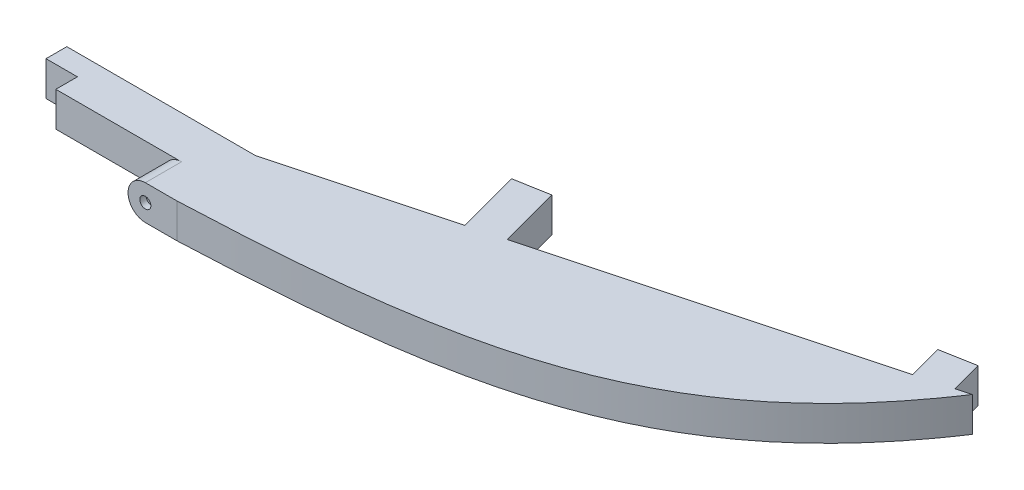
ISO-10303-21;
HEADER;
FILE_DESCRIPTION(('STEP AP214'),'2;1');
FILE_NAME('part.step','',(''),(''),'','','');
FILE_SCHEMA(('AUTOMOTIVE_DESIGN { 1 0 10303 214 1 1 1 1 }'));
ENDSEC;
DATA;
#1=APPLICATION_CONTEXT('core data for automotive mechanical design processes');
#2=APPLICATION_PROTOCOL_DEFINITION('international standard','automotive_design',2000,#1);
#3=PRODUCT_CONTEXT('',#1,'mechanical');
#4=PRODUCT('Part','Part','',(#3));
#5=PRODUCT_RELATED_PRODUCT_CATEGORY('part','',(#4));
#6=PRODUCT_DEFINITION_FORMATION('','',#4);
#7=PRODUCT_DEFINITION_CONTEXT('part definition',#1,'design');
#8=PRODUCT_DEFINITION('design','',#6,#7);
#9=PRODUCT_DEFINITION_SHAPE('','',#8);
#10=(LENGTH_UNIT() NAMED_UNIT(*) SI_UNIT(.MILLI.,.METRE.));
#11=(NAMED_UNIT(*) PLANE_ANGLE_UNIT() SI_UNIT($,.RADIAN.));
#12=(NAMED_UNIT(*) SI_UNIT($,.STERADIAN.) SOLID_ANGLE_UNIT());
#13=UNCERTAINTY_MEASURE_WITH_UNIT(LENGTH_MEASURE(1.E-05),#10,'distance_accuracy_value','');
#14=(GEOMETRIC_REPRESENTATION_CONTEXT(3) GLOBAL_UNCERTAINTY_ASSIGNED_CONTEXT((#13)) GLOBAL_UNIT_ASSIGNED_CONTEXT((#10,
#11,#12)) REPRESENTATION_CONTEXT('',''));
#15=CARTESIAN_POINT('',(0.,0.,0.));
#16=DIRECTION('',(0.,0.,1.));
#17=DIRECTION('',(1.,0.,0.));
#18=AXIS2_PLACEMENT_3D('',#15,#16,#17);
#19=CARTESIAN_POINT('',(-3.12500000003779,5.5,-11.6626587736309));
#20=DIRECTION('',(-0.258819045105893,0.,-0.965925826288165));
#21=DIRECTION('',(-0.965925826288165,0.,0.258819045105893));
#22=AXIS2_PLACEMENT_3D('',#19,#20,#21);
#23=PLANE('',#22);
#24=DIRECTION('',(0.965925826288165,0.,-0.258819045105893));
#25=VECTOR('',#24,1.);
#26=CARTESIAN_POINT('',(-3.12500000003779,5.5,-11.6626587736309));
#27=LINE('',#26,#25);
#28=CARTESIAN_POINT('',(31.6340708109374,5.5,-20.976323727218));
#29=VERTEX_POINT('',#28);
#30=CARTESIAN_POINT('',(82.5140748462668,5.5,-34.6095797195671));
#31=VERTEX_POINT('',#30);
#32=EDGE_CURVE('E298',#29,#31,#27,.T.);
#33=ORIENTED_EDGE('',*,*,#32,.T.);
#34=DIRECTION('',(0.,1.,0.));
#35=VECTOR('',#34,1.);
#36=CARTESIAN_POINT('',(82.5140748462667,0.,-34.6095797195671));
#37=LINE('',#36,#35);
#38=CARTESIAN_POINT('',(82.5140748462668,0.,-34.6095797195671));
#39=VERTEX_POINT('',#38);
#40=EDGE_CURVE('E61',#39,#31,#37,.T.);
#41=ORIENTED_EDGE('',*,*,#40,.F.);
#42=DIRECTION('',(0.965925826288165,0.,-0.258819045105893));
#43=VECTOR('',#42,1.);
#44=CARTESIAN_POINT('',(-3.12500000003779,0.,-11.6626587736309));
#45=LINE('',#44,#43);
#46=CARTESIAN_POINT('',(31.6340708109374,0.,-20.976323727218));
#47=VERTEX_POINT('',#46);
#48=EDGE_CURVE('E288',#47,#39,#45,.T.);
#49=ORIENTED_EDGE('',*,*,#48,.F.);
#50=DIRECTION('',(0.,1.,0.));
#51=VECTOR('',#50,1.);
#52=CARTESIAN_POINT('',(31.6340708109374,0.,-20.976323727218));
#53=LINE('',#52,#51);
#54=EDGE_CURVE('E203',#47,#29,#53,.T.);
#55=ORIENTED_EDGE('',*,*,#54,.T.);
#56=EDGE_LOOP('',(#33,#41,#49,#55));
#57=FACE_BOUND('',#56,.T.);
#58=ADVANCED_FACE('F35',(#57),#23,.T.);
#59=CARTESIAN_POINT('',(0.,5.5,-12.5));
#60=VERTEX_POINT('',#59);
#61=CARTESIAN_POINT('',(26.3214787663525,5.5,-19.5528189791356));
#62=VERTEX_POINT('',#61);
#63=EDGE_CURVE('E283',#60,#62,#27,.T.);
#64=ORIENTED_EDGE('',*,*,#63,.T.);
#65=DIRECTION('',(0.,1.,0.));
#66=VECTOR('',#65,1.);
#67=CARTESIAN_POINT('',(26.3214787663525,0.,-19.5528189791356));
#68=LINE('',#67,#66);
#69=CARTESIAN_POINT('',(26.3214787663525,0.,-19.5528189791356));
#70=VERTEX_POINT('',#69);
#71=EDGE_CURVE('E211',#70,#62,#68,.T.);
#72=ORIENTED_EDGE('',*,*,#71,.F.);
#73=CARTESIAN_POINT('',(0.,0.,-12.5));
#74=VERTEX_POINT('',#73);
#75=EDGE_CURVE('E284',#74,#70,#45,.T.);
#76=ORIENTED_EDGE('',*,*,#75,.F.);
#77=DIRECTION('',(0.,-1.,0.));
#78=VECTOR('',#77,1.);
#79=CARTESIAN_POINT('',(0.,5.5,-12.5));
#80=LINE('',#79,#78);
#81=EDGE_CURVE('E280',#60,#74,#80,.T.);
#82=ORIENTED_EDGE('',*,*,#81,.F.);
#83=EDGE_LOOP('',(#64,#72,#76,#82));
#84=FACE_BOUND('',#83,.T.);
#85=ADVANCED_FACE('F357',(#84),#23,.T.);
#86=CARTESIAN_POINT('',(0.,5.5,0.));
#87=DIRECTION('',(0.,1.,0.));
#88=DIRECTION('',(0.,0.,1.));
#89=AXIS2_PLACEMENT_3D('',#86,#87,#88);
#90=PLANE('',#89);
#91=DIRECTION('',(-1.,0.,0.));
#92=VECTOR('',#91,1.);
#93=CARTESIAN_POINT('',(0.,5.5,-5.75));
#94=LINE('',#93,#92);
#95=CARTESIAN_POINT('',(-5.,5.5,-5.75));
#96=VERTEX_POINT('',#95);
#97=CARTESIAN_POINT('',(-25.,5.5,-5.75));
#98=VERTEX_POINT('',#97);
#99=EDGE_CURVE('E257',#96,#98,#94,.T.);
#100=ORIENTED_EDGE('',*,*,#99,.F.);
#101=DIRECTION('',(0.,0.,1.));
#102=VECTOR('',#101,1.);
#103=CARTESIAN_POINT('',(-5.,5.5,-5.75));
#104=LINE('',#103,#102);
#105=CARTESIAN_POINT('',(-5.,5.5,0.));
#106=VERTEX_POINT('',#105);
#107=EDGE_CURVE('E265',#96,#106,#104,.T.);
#108=ORIENTED_EDGE('',*,*,#107,.T.);
#109=DIRECTION('',(1.,0.,0.));
#110=VECTOR('',#109,1.);
#111=CARTESIAN_POINT('',(-25.,5.5,0.));
#112=LINE('',#111,#110);
#113=CARTESIAN_POINT('',(0.,5.5,0.));
#114=VERTEX_POINT('',#113);
#115=EDGE_CURVE('E294',#106,#114,#112,.T.);
#116=ORIENTED_EDGE('',*,*,#115,.T.);
#117=CARTESIAN_POINT('',(-3.99701542976772E-10,5.5,1.60987063267593E-11));
#118=CARTESIAN_POINT('',(0.391394635243987,5.5,-0.0157750053797903));
#119=CARTESIAN_POINT('',(1.18697403500994,5.5,-0.0487759685721944));
#120=CARTESIAN_POINT('',(2.97371886532466,5.5,-0.125104104098016));
#121=CARTESIAN_POINT('',(4.54008890350178,5.5,-0.200260299116027));
#122=CARTESIAN_POINT('',(6.56661566228479,5.5,-0.300718996412045));
#123=CARTESIAN_POINT('',(8.32527633580625,5.5,-0.397659311451367));
#124=CARTESIAN_POINT('',(10.2393452977797,5.5,-0.508699866994759));
#125=CARTESIAN_POINT('',(12.0656989604106,5.5,-0.624646024555069));
#126=CARTESIAN_POINT('',(14.40145764918,5.5,-0.783062706143124));
#127=CARTESIAN_POINT('',(17.1745755641682,5.5,-0.991527453441799));
#128=CARTESIAN_POINT('',(20.424315772466,5.5,-1.26709563175987));
#129=CARTESIAN_POINT('',(24.1240411308153,5.5,-1.63189072491645));
#130=CARTESIAN_POINT('',(28.7464994471539,5.5,-2.16058829893543));
#131=CARTESIAN_POINT('',(34.1867170255386,5.5,-2.91640899189201));
#132=CARTESIAN_POINT('',(39.5992056703536,5.5,-3.86946359541546));
#133=CARTESIAN_POINT('',(44.9594427783575,5.5,-5.07707429287321));
#134=CARTESIAN_POINT('',(49.3618158266038,5.5,-6.28041823104868));
#135=CARTESIAN_POINT('',(52.9106920919481,5.5,-7.40087892256267));
#136=CARTESIAN_POINT('',(56.4081688521761,5.5,-8.67392879261675));
#137=CARTESIAN_POINT('',(59.8414498968872,5.5,-10.1114509716341));
#138=CARTESIAN_POINT('',(63.1969179772328,5.5,-11.7229728519031));
#139=CARTESIAN_POINT('',(66.4599871789213,5.5,-13.5144576410817));
#140=CARTESIAN_POINT('',(69.6166694042394,5.5,-15.487724176846));
#141=CARTESIAN_POINT('',(72.6542167339057,5.5,-17.6397938307028));
#142=CARTESIAN_POINT('',(75.5626334687585,5.5,-19.9635545523168));
#143=CARTESIAN_POINT('',(78.4114017746989,5.5,-22.5164023394282));
#144=CARTESIAN_POINT('',(80.637238298566,5.5,-24.7501277094886));
#145=CARTESIAN_POINT('',(82.3142030197585,5.5,-26.5768651787128));
#146=CARTESIAN_POINT('',(83.5001747606079,5.5,-27.9419093881025));
#147=CARTESIAN_POINT('',(84.1664515213518,5.5,-28.7295443987983));
#148=CARTESIAN_POINT('',(84.8247205965813,5.5,-29.5294985845606));
#149=CARTESIAN_POINT('',(85.4679017851143,5.5,-30.3305725761852));
#150=CARTESIAN_POINT('',(86.1096180697003,5.5,-31.152932898829));
#151=CARTESIAN_POINT('',(86.7258248018456,5.5,-31.9596372628073));
#152=CARTESIAN_POINT('',(87.3592157753844,5.5,-32.8149139023531));
#153=CARTESIAN_POINT('',(87.9353037158166,5.5,-33.6053343053545));
#154=CARTESIAN_POINT('',(88.5853514629931,5.5,-34.5293993999494));
#155=CARTESIAN_POINT('',(89.0772563702062,5.5,-35.2347214328894));
#156=CARTESIAN_POINT('',(89.639386065092,5.5,-36.0720039579726));
#157=CARTESIAN_POINT('',(89.8802416271091,5.5,-36.4338646602888));
#158=CARTESIAN_POINT('',(89.9999999999999,5.5,-36.6154273191376));
#159=B_SPLINE_CURVE_WITH_KNOTS('',4,(#117,#118,#119,#120,#121,#122,#123,#124,#125,#126,#127,
#128,#129,#130,#131,#132,#133,#134,#135,#136,#137,#138,#139,#140,#141,#142,#143,#144,#145,#146,
#147,#148,#149,#150,#151,#152,#153,#154,#155,#156,#157,#158),.UNSPECIFIED.,.F.,.F.,(5,1,1,1,1,1,
1,1,1,1,1,1,1,1,1,1,1,1,1,1,1,1,1,1,1,1,1,1,1,1,1,1,1,1,1,1,1,1,5),(0.0745428257623953,
0.0899420051313668,0.105341184500338,0.12074036386931,0.136139543238281,0.151538722821234,
0.166937902404187,0.18233708198714,0.197736261570092,0.22853461972874,0.259332977887387,
0.290131334919768,0.320929691952149,0.382526405312846,0.441205382352089,0.472003704326887,
0.502802054328003,0.533600415642708,0.564398766278646,0.595197066314678,0.62599542278122,
0.656793871998032,0.687592091282058,0.718390432587616,0.749188737095499,0.779987362687061,
0.814189108794913,0.82273965192033,0.831290195045747,0.839840738171165,0.848391281296582,
0.856941795912113,0.865492310527644,0.874042825143175,0.882593339758706,0.891143874173129,
0.899694408587551,0.908244943001974,0.916795477416396),.UNSPECIFIED.);
#160=CARTESIAN_POINT('',(90.,5.5,-36.6154273191378));
#161=VERTEX_POINT('',#160);
#162=EDGE_CURVE('E287',#114,#161,#159,.T.);
#163=ORIENTED_EDGE('',*,*,#162,.T.);
#164=CARTESIAN_POINT('',(87.8266668908516,5.5,-36.0330844676495));
#165=VERTEX_POINT('',#164);
#166=EDGE_CURVE('E299',#165,#161,#27,.T.);
#167=ORIENTED_EDGE('',*,*,#166,.F.);
#168=DIRECTION('',(-0.258819045105892,0.,-0.965925826288165));
#169=VECTOR('',#168,1.);
#170=CARTESIAN_POINT('',(90.9516668908894,5.5,-24.3704256940185));
#171=LINE('',#170,#169);
#172=CARTESIAN_POINT('',(86.4840847989428,5.5,-41.0436690479154));
#173=VERTEX_POINT('',#172);
#174=EDGE_CURVE('E188',#165,#173,#171,.T.);
#175=ORIENTED_EDGE('',*,*,#174,.T.);
#176=DIRECTION('',(-0.984070395292495,0.,0.177779237001607));
#177=VECTOR('',#176,1.);
#178=CARTESIAN_POINT('',(-4.44710939388558,5.5,-24.6163093787516));
#179=LINE('',#178,#177);
#180=CARTESIAN_POINT('',(81.0529693032083,5.5,-40.0624998414052));
#181=VERTEX_POINT('',#180);
#182=EDGE_CURVE('E164',#173,#181,#179,.T.);
#183=ORIENTED_EDGE('',*,*,#182,.T.);
#184=DIRECTION('',(-0.258819045105893,0.,-0.965925826288165));
#185=VECTOR('',#184,1.);
#186=CARTESIAN_POINT('',(85.6390748463045,5.5,-22.9469209459362));
#187=LINE('',#186,#185);
#188=EDGE_CURVE('E185',#31,#181,#187,.T.);
#189=ORIENTED_EDGE('',*,*,#188,.F.);
#190=ORIENTED_EDGE('',*,*,#32,.F.);
#191=DIRECTION('',(-0.258819045105893,0.,-0.965925826288165));
#192=VECTOR('',#191,1.);
#193=CARTESIAN_POINT('',(34.7590708109752,5.5,-9.31366495358707));
#194=LINE('',#193,#192);
#195=CARTESIAN_POINT('',(29.0378369496948,5.5,-30.6656004055709));
#196=VERTEX_POINT('',#195);
#197=EDGE_CURVE('E191',#29,#196,#194,.T.);
#198=ORIENTED_EDGE('',*,*,#197,.T.);
#199=DIRECTION('',(-0.984070395292495,0.,0.177779237001607));
#200=VECTOR('',#199,1.);
#201=CARTESIAN_POINT('',(-4.44710939388558,5.5,-24.6163093787516));
#202=LINE('',#201,#200);
#203=CARTESIAN_POINT('',(23.6067214539603,5.5,-29.6844311990608));
#204=VERTEX_POINT('',#203);
#205=EDGE_CURVE('E206',#196,#204,#202,.T.);
#206=ORIENTED_EDGE('',*,*,#205,.T.);
#207=DIRECTION('',(-0.258819045105893,0.,-0.965925826288165));
#208=VECTOR('',#207,1.);
#209=CARTESIAN_POINT('',(29.4464787663903,5.5,-7.89016020550466));
#210=LINE('',#209,#208);
#211=EDGE_CURVE('E198',#62,#204,#210,.T.);
#212=ORIENTED_EDGE('',*,*,#211,.F.);
#213=ORIENTED_EDGE('',*,*,#63,.F.);
#214=DIRECTION('',(1.,0.,0.));
#215=VECTOR('',#214,1.);
#216=CARTESIAN_POINT('',(-25.,5.5,-12.5));
#217=LINE('',#216,#215);
#218=CARTESIAN_POINT('',(-30.,5.5,-12.5));
#219=VERTEX_POINT('',#218);
#220=EDGE_CURVE('E309',#219,#60,#217,.T.);
#221=ORIENTED_EDGE('',*,*,#220,.F.);
#222=DIRECTION('',(0.,0.,-1.));
#223=VECTOR('',#222,1.);
#224=CARTESIAN_POINT('',(-30.,5.5,0.));
#225=LINE('',#224,#223);
#226=CARTESIAN_POINT('',(-30.,5.5,-9.18749999999999));
#227=VERTEX_POINT('',#226);
#228=EDGE_CURVE('E224',#227,#219,#225,.T.);
#229=ORIENTED_EDGE('',*,*,#228,.F.);
#230=DIRECTION('',(1.,0.,0.));
#231=VECTOR('',#230,1.);
#232=CARTESIAN_POINT('',(-30.,5.5,-9.18749999999999));
#233=LINE('',#232,#231);
#234=CARTESIAN_POINT('',(-25.,5.5,-9.18749999999999));
#235=VERTEX_POINT('',#234);
#236=EDGE_CURVE('E245',#227,#235,#233,.T.);
#237=ORIENTED_EDGE('',*,*,#236,.T.);
#238=DIRECTION('',(0.,0.,-1.));
#239=VECTOR('',#238,1.);
#240=CARTESIAN_POINT('',(-25.,5.5,-12.5));
#241=LINE('',#240,#239);
#242=EDGE_CURVE('E271',#98,#235,#241,.T.);
#243=ORIENTED_EDGE('',*,*,#242,.F.);
#244=EDGE_LOOP('',(#100,#108,#116,#163,#167,#175,#183,#189,#190,#198,#206,#212,#213,#221,#229,
#237,#243));
#245=FACE_BOUND('',#244,.T.);
#246=ADVANCED_FACE('F332',(#245),#90,.T.);
#247=CARTESIAN_POINT('',(0.,0.,0.));
#248=DIRECTION('',(0.,1.,0.));
#249=DIRECTION('',(0.,0.,1.));
#250=AXIS2_PLACEMENT_3D('',#247,#248,#249);
#251=PLANE('',#250);
#252=DIRECTION('',(0.,0.,1.));
#253=VECTOR('',#252,1.);
#254=CARTESIAN_POINT('',(-5.,0.,-5.75));
#255=LINE('',#254,#253);
#256=CARTESIAN_POINT('',(-5.,0.,-5.75));
#257=VERTEX_POINT('',#256);
#258=CARTESIAN_POINT('',(-5.,0.,0.));
#259=VERTEX_POINT('',#258);
#260=EDGE_CURVE('E262',#257,#259,#255,.T.);
#261=ORIENTED_EDGE('',*,*,#260,.F.);
#262=DIRECTION('',(1.,0.,0.));
#263=VECTOR('',#262,1.);
#264=CARTESIAN_POINT('',(0.,0.,-5.75));
#265=LINE('',#264,#263);
#266=CARTESIAN_POINT('',(-25.,0.,-5.75));
#267=VERTEX_POINT('',#266);
#268=EDGE_CURVE('E260',#267,#257,#265,.T.);
#269=ORIENTED_EDGE('',*,*,#268,.F.);
#270=DIRECTION('',(0.,0.,1.));
#271=VECTOR('',#270,1.);
#272=CARTESIAN_POINT('',(-25.,0.,-12.5));
#273=LINE('',#272,#271);
#274=CARTESIAN_POINT('',(-25.,0.,-9.18749999999999));
#275=VERTEX_POINT('',#274);
#276=EDGE_CURVE('E241',#275,#267,#273,.T.);
#277=ORIENTED_EDGE('',*,*,#276,.F.);
#278=DIRECTION('',(1.,0.,0.));
#279=VECTOR('',#278,1.);
#280=CARTESIAN_POINT('',(-30.,0.,-9.18749999999999));
#281=LINE('',#280,#279);
#282=CARTESIAN_POINT('',(-30.,0.,-9.18749999999999));
#283=VERTEX_POINT('',#282);
#284=EDGE_CURVE('E232',#283,#275,#281,.T.);
#285=ORIENTED_EDGE('',*,*,#284,.F.);
#286=DIRECTION('',(0.,0.,1.));
#287=VECTOR('',#286,1.);
#288=CARTESIAN_POINT('',(-30.,0.,0.));
#289=LINE('',#288,#287);
#290=CARTESIAN_POINT('',(-30.,0.,-12.5));
#291=VERTEX_POINT('',#290);
#292=EDGE_CURVE('E230',#291,#283,#289,.T.);
#293=ORIENTED_EDGE('',*,*,#292,.F.);
#294=DIRECTION('',(1.,0.,0.));
#295=VECTOR('',#294,1.);
#296=CARTESIAN_POINT('',(-25.,0.,-12.5));
#297=LINE('',#296,#295);
#298=EDGE_CURVE('E312',#291,#74,#297,.T.);
#299=ORIENTED_EDGE('',*,*,#298,.T.);
#300=ORIENTED_EDGE('',*,*,#75,.T.);
#301=DIRECTION('',(-0.258819045105893,0.,-0.965925826288165));
#302=VECTOR('',#301,1.);
#303=CARTESIAN_POINT('',(29.4464787663903,0.,-7.89016020550466));
#304=LINE('',#303,#302);
#305=CARTESIAN_POINT('',(23.6067214539603,0.,-29.6844311990608));
#306=VERTEX_POINT('',#305);
#307=EDGE_CURVE('E201',#70,#306,#304,.T.);
#308=ORIENTED_EDGE('',*,*,#307,.T.);
#309=DIRECTION('',(-0.984070395292495,0.,0.177779237001607));
#310=VECTOR('',#309,1.);
#311=CARTESIAN_POINT('',(-4.44710939388558,0.,-24.6163093787516));
#312=LINE('',#311,#310);
#313=CARTESIAN_POINT('',(29.0378369496948,0.,-30.6656004055709));
#314=VERTEX_POINT('',#313);
#315=EDGE_CURVE('E197',#314,#306,#312,.T.);
#316=ORIENTED_EDGE('',*,*,#315,.F.);
#317=DIRECTION('',(-0.258819045105893,0.,-0.965925826288165));
#318=VECTOR('',#317,1.);
#319=CARTESIAN_POINT('',(34.7590708109752,0.,-9.31366495358707));
#320=LINE('',#319,#318);
#321=EDGE_CURVE('E194',#47,#314,#320,.T.);
#322=ORIENTED_EDGE('',*,*,#321,.F.);
#323=ORIENTED_EDGE('',*,*,#48,.T.);
#324=DIRECTION('',(-0.258819045105893,0.,-0.965925826288165));
#325=VECTOR('',#324,1.);
#326=CARTESIAN_POINT('',(85.6390748463045,0.,-22.9469209459362));
#327=LINE('',#326,#325);
#328=CARTESIAN_POINT('',(81.0529693032083,0.,-40.0624998414052));
#329=VERTEX_POINT('',#328);
#330=EDGE_CURVE('E175',#39,#329,#327,.T.);
#331=ORIENTED_EDGE('',*,*,#330,.T.);
#332=DIRECTION('',(-0.984070395292495,0.,0.177779237001607));
#333=VECTOR('',#332,1.);
#334=CARTESIAN_POINT('',(-4.44710939388558,0.,-24.6163093787516));
#335=LINE('',#334,#333);
#336=CARTESIAN_POINT('',(86.4840847989428,0.,-41.0436690479154));
#337=VERTEX_POINT('',#336);
#338=EDGE_CURVE('E162',#337,#329,#335,.T.);
#339=ORIENTED_EDGE('',*,*,#338,.F.);
#340=DIRECTION('',(-0.258819045105892,0.,-0.965925826288165));
#341=VECTOR('',#340,1.);
#342=CARTESIAN_POINT('',(90.9516668908894,0.,-24.3704256940185));
#343=LINE('',#342,#341);
#344=CARTESIAN_POINT('',(87.8266668908516,0.,-36.0330844676495));
#345=VERTEX_POINT('',#344);
#346=EDGE_CURVE('E172',#345,#337,#343,.T.);
#347=ORIENTED_EDGE('',*,*,#346,.F.);
#348=CARTESIAN_POINT('',(90.,0.,-36.6154273191378));
#349=VERTEX_POINT('',#348);
#350=EDGE_CURVE('E53',#345,#349,#45,.T.);
#351=ORIENTED_EDGE('',*,*,#350,.T.);
#352=CARTESIAN_POINT('',(-3.99701542976772E-10,0.,1.60987063267593E-11));
#353=CARTESIAN_POINT('',(0.391394635243987,0.,-0.0157750053797903));
#354=CARTESIAN_POINT('',(1.18697403500994,0.,-0.0487759685721944));
#355=CARTESIAN_POINT('',(2.97371886532466,0.,-0.125104104098016));
#356=CARTESIAN_POINT('',(4.54008890350178,0.,-0.200260299116027));
#357=CARTESIAN_POINT('',(6.56661566228479,0.,-0.300718996412045));
#358=CARTESIAN_POINT('',(8.32527633580625,0.,-0.397659311451367));
#359=CARTESIAN_POINT('',(10.2393452977797,0.,-0.508699866994759));
#360=CARTESIAN_POINT('',(12.0656989604106,0.,-0.624646024555069));
#361=CARTESIAN_POINT('',(14.40145764918,0.,-0.783062706143124));
#362=CARTESIAN_POINT('',(17.1745755641682,0.,-0.991527453441799));
#363=CARTESIAN_POINT('',(20.424315772466,0.,-1.26709563175987));
#364=CARTESIAN_POINT('',(24.1240411308153,0.,-1.63189072491645));
#365=CARTESIAN_POINT('',(28.7464994471539,0.,-2.16058829893543));
#366=CARTESIAN_POINT('',(34.1867170255386,0.,-2.91640899189201));
#367=CARTESIAN_POINT('',(39.5992056703536,0.,-3.86946359541546));
#368=CARTESIAN_POINT('',(44.9594427783575,0.,-5.07707429287321));
#369=CARTESIAN_POINT('',(49.3618158266038,0.,-6.28041823104868));
#370=CARTESIAN_POINT('',(52.9106920919481,0.,-7.40087892256267));
#371=CARTESIAN_POINT('',(56.4081688521761,0.,-8.67392879261675));
#372=CARTESIAN_POINT('',(59.8414498968872,0.,-10.1114509716341));
#373=CARTESIAN_POINT('',(63.1969179772328,0.,-11.7229728519031));
#374=CARTESIAN_POINT('',(66.4599871789213,0.,-13.5144576410817));
#375=CARTESIAN_POINT('',(69.6166694042394,0.,-15.487724176846));
#376=CARTESIAN_POINT('',(72.6542167339057,0.,-17.6397938307028));
#377=CARTESIAN_POINT('',(75.5626334687585,0.,-19.9635545523168));
#378=CARTESIAN_POINT('',(78.4114017746989,0.,-22.5164023394282));
#379=CARTESIAN_POINT('',(80.637238298566,0.,-24.7501277094886));
#380=CARTESIAN_POINT('',(82.3142030197585,0.,-26.5768651787128));
#381=CARTESIAN_POINT('',(83.5001747606079,0.,-27.9419093881025));
#382=CARTESIAN_POINT('',(84.1664515213518,0.,-28.7295443987983));
#383=CARTESIAN_POINT('',(84.8247205965813,0.,-29.5294985845606));
#384=CARTESIAN_POINT('',(85.4679017851143,0.,-30.3305725761852));
#385=CARTESIAN_POINT('',(86.1096180697003,0.,-31.152932898829));
#386=CARTESIAN_POINT('',(86.7258248018456,0.,-31.9596372628073));
#387=CARTESIAN_POINT('',(87.3592157753844,0.,-32.8149139023531));
#388=CARTESIAN_POINT('',(87.9353037158166,0.,-33.6053343053545));
#389=CARTESIAN_POINT('',(88.5853514629931,0.,-34.5293993999494));
#390=CARTESIAN_POINT('',(89.0772563702062,0.,-35.2347214328894));
#391=CARTESIAN_POINT('',(89.639386065092,0.,-36.0720039579726));
#392=CARTESIAN_POINT('',(89.8802416271091,0.,-36.4338646602888));
#393=CARTESIAN_POINT('',(89.9999999999999,0.,-36.6154273191376));
#394=B_SPLINE_CURVE_WITH_KNOTS('',4,(#352,#353,#354,#355,#356,#357,#358,#359,#360,#361,#362,
#363,#364,#365,#366,#367,#368,#369,#370,#371,#372,#373,#374,#375,#376,#377,#378,#379,#380,#381,
#382,#383,#384,#385,#386,#387,#388,#389,#390,#391,#392,#393),.UNSPECIFIED.,.F.,.F.,(5,1,1,1,1,1,
1,1,1,1,1,1,1,1,1,1,1,1,1,1,1,1,1,1,1,1,1,1,1,1,1,1,1,1,1,1,1,1,5),(0.0745428257623953,
0.0899420051313668,0.105341184500338,0.12074036386931,0.136139543238281,0.151538722821234,
0.166937902404187,0.18233708198714,0.197736261570092,0.22853461972874,0.259332977887387,
0.290131334919768,0.320929691952149,0.382526405312846,0.441205382352089,0.472003704326887,
0.502802054328003,0.533600415642708,0.564398766278646,0.595197066314678,0.62599542278122,
0.656793871998032,0.687592091282058,0.718390432587616,0.749188737095499,0.779987362687061,
0.814189108794913,0.82273965192033,0.831290195045747,0.839840738171165,0.848391281296582,
0.856941795912113,0.865492310527644,0.874042825143175,0.882593339758706,0.891143874173129,
0.899694408587551,0.908244943001974,0.916795477416396),.UNSPECIFIED.);
#395=CARTESIAN_POINT('',(0.,0.,0.));
#396=VERTEX_POINT('',#395);
#397=EDGE_CURVE('E289',#396,#349,#394,.T.);
#398=ORIENTED_EDGE('',*,*,#397,.F.);
#399=DIRECTION('',(1.,0.,0.));
#400=VECTOR('',#399,1.);
#401=CARTESIAN_POINT('',(-25.,0.,0.));
#402=LINE('',#401,#400);
#403=EDGE_CURVE('E314',#259,#396,#402,.T.);
#404=ORIENTED_EDGE('',*,*,#403,.F.);
#405=EDGE_LOOP('',(#261,#269,#277,#285,#293,#299,#300,#308,#316,#322,#323,#331,#339,#347,#351,
#398,#404));
#406=FACE_BOUND('',#405,.T.);
#407=ADVANCED_FACE('F178',(#406),#251,.F.);
#408=CARTESIAN_POINT('',(-25.,0.,0.));
#409=DIRECTION('',(0.,0.,-1.));
#410=DIRECTION('',(0.,1.,0.));
#411=AXIS2_PLACEMENT_3D('',#408,#409,#410);
#412=PLANE('',#411);
#413=CARTESIAN_POINT('',(-5.,2.75,0.));
#414=DIRECTION('',(0.,0.,1.));
#415=DIRECTION('',(1.,0.,0.));
#416=AXIS2_PLACEMENT_3D('',#413,#414,#415);
#417=CIRCLE('',#416,0.880000000000001);
#418=CARTESIAN_POINT('',(-4.12,2.75,0.));
#419=VERTEX_POINT('',#418);
#420=EDGE_CURVE('E264',#419,#419,#417,.T.);
#421=ORIENTED_EDGE('',*,*,#420,.F.);
#422=EDGE_LOOP('',(#421));
#423=FACE_BOUND('',#422,.T.);
#424=CARTESIAN_POINT('',(-5.,2.75,0.));
#425=DIRECTION('',(0.,0.,1.));
#426=DIRECTION('',(1.,0.,0.));
#427=AXIS2_PLACEMENT_3D('',#424,#425,#426);
#428=CIRCLE('',#427,2.75);
#429=EDGE_CURVE('E247',#106,#259,#428,.T.);
#430=ORIENTED_EDGE('',*,*,#429,.T.);
#431=ORIENTED_EDGE('',*,*,#403,.T.);
#432=DIRECTION('',(0.,-1.,0.));
#433=VECTOR('',#432,1.);
#434=CARTESIAN_POINT('',(0.,5.5,0.));
#435=LINE('',#434,#433);
#436=EDGE_CURVE('E11',#114,#396,#435,.T.);
#437=ORIENTED_EDGE('',*,*,#436,.F.);
#438=ORIENTED_EDGE('',*,*,#115,.F.);
#439=EDGE_LOOP('',(#430,#431,#437,#438));
#440=FACE_BOUND('',#439,.T.);
#441=ADVANCED_FACE('F334',(#423,#440),#412,.F.);
#442=CARTESIAN_POINT('',(-25.,0.,0.));
#443=DIRECTION('',(1.,0.,0.));
#444=DIRECTION('',(0.,0.,-1.));
#445=AXIS2_PLACEMENT_3D('',#442,#443,#444);
#446=PLANE('',#445);
#447=ORIENTED_EDGE('',*,*,#242,.T.);
#448=DIRECTION('',(0.,-1.,0.));
#449=VECTOR('',#448,1.);
#450=CARTESIAN_POINT('',(-25.,0.,-9.18749999999999));
#451=LINE('',#450,#449);
#452=EDGE_CURVE('E214',#235,#275,#451,.T.);
#453=ORIENTED_EDGE('',*,*,#452,.T.);
#454=ORIENTED_EDGE('',*,*,#276,.T.);
#455=DIRECTION('',(0.,-1.,0.));
#456=VECTOR('',#455,1.);
#457=CARTESIAN_POINT('',(-25.,0.,-5.75));
#458=LINE('',#457,#456);
#459=EDGE_CURVE('E321',#98,#267,#458,.T.);
#460=ORIENTED_EDGE('',*,*,#459,.F.);
#461=EDGE_LOOP('',(#447,#453,#454,#460));
#462=FACE_BOUND('',#461,.T.);
#463=ADVANCED_FACE('F320',(#462),#446,.F.);
#464=DIRECTION('',(0.,-1.,0.));
#465=VECTOR('',#464,1.);
#466=SURFACE_OF_LINEAR_EXTRUSION('',#159,#465);
#467=ORIENTED_EDGE('',*,*,#397,.T.);
#468=DIRECTION('',(0.,-1.,0.));
#469=VECTOR('',#468,1.);
#470=CARTESIAN_POINT('',(90.,5.5,-36.6154273191378));
#471=LINE('',#470,#469);
#472=EDGE_CURVE('E45',#161,#349,#471,.T.);
#473=ORIENTED_EDGE('',*,*,#472,.F.);
#474=ORIENTED_EDGE('',*,*,#162,.F.);
#475=ORIENTED_EDGE('',*,*,#436,.T.);
#476=EDGE_LOOP('',(#467,#473,#474,#475));
#477=FACE_BOUND('',#476,.T.);
#478=ADVANCED_FACE('F37',(#477),#466,.F.);
#479=DIRECTION('',(0.,1.,0.));
#480=VECTOR('',#479,1.);
#481=CARTESIAN_POINT('',(87.8266668908516,0.,-36.0330844676495));
#482=LINE('',#481,#480);
#483=EDGE_CURVE('E169',#345,#165,#482,.T.);
#484=ORIENTED_EDGE('',*,*,#483,.T.);
#485=ORIENTED_EDGE('',*,*,#166,.T.);
#486=ORIENTED_EDGE('',*,*,#472,.T.);
#487=ORIENTED_EDGE('',*,*,#350,.F.);
#488=EDGE_LOOP('',(#484,#485,#486,#487));
#489=FACE_BOUND('',#488,.T.);
#490=ADVANCED_FACE('F337',(#489),#23,.T.);
#491=CARTESIAN_POINT('',(-25.,0.,-12.5));
#492=DIRECTION('',(0.,0.,1.));
#493=DIRECTION('',(1.,0.,0.));
#494=AXIS2_PLACEMENT_3D('',#491,#492,#493);
#495=PLANE('',#494);
#496=ORIENTED_EDGE('',*,*,#81,.T.);
#497=ORIENTED_EDGE('',*,*,#298,.F.);
#498=DIRECTION('',(0.,-1.,0.));
#499=VECTOR('',#498,1.);
#500=CARTESIAN_POINT('',(-30.,0.,-12.5));
#501=LINE('',#500,#499);
#502=EDGE_CURVE('E227',#219,#291,#501,.T.);
#503=ORIENTED_EDGE('',*,*,#502,.F.);
#504=ORIENTED_EDGE('',*,*,#220,.T.);
#505=EDGE_LOOP('',(#496,#497,#503,#504));
#506=FACE_BOUND('',#505,.T.);
#507=ADVANCED_FACE('F364',(#506),#495,.F.);
#508=CARTESIAN_POINT('',(-5.,2.75,-1.));
#509=DIRECTION('',(0.,0.,1.));
#510=DIRECTION('',(1.,0.,0.));
#511=AXIS2_PLACEMENT_3D('',#508,#509,#510);
#512=CYLINDRICAL_SURFACE('',#511,0.880000000000001);
#513=CARTESIAN_POINT('',(-5.,2.75,-1.));
#514=DIRECTION('',(0.,0.,1.));
#515=DIRECTION('',(1.,0.,0.));
#516=AXIS2_PLACEMENT_3D('',#513,#514,#515);
#517=CIRCLE('',#516,0.880000000000001);
#518=CARTESIAN_POINT('',(-4.12,2.75,-1.));
#519=VERTEX_POINT('',#518);
#520=EDGE_CURVE('E268',#519,#519,#517,.T.);
#521=ORIENTED_EDGE('',*,*,#520,.F.);
#522=EDGE_LOOP('',(#521));
#523=FACE_BOUND('',#522,.T.);
#524=ORIENTED_EDGE('',*,*,#420,.T.);
#525=EDGE_LOOP('',(#524));
#526=FACE_BOUND('',#525,.T.);
#527=ADVANCED_FACE('F369',(#523,#526),#512,.F.);
#528=CARTESIAN_POINT('',(-5.,2.75,-1.));
#529=DIRECTION('',(0.,0.,1.));
#530=DIRECTION('',(1.,0.,0.));
#531=AXIS2_PLACEMENT_3D('',#528,#529,#530);
#532=PLANE('',#531);
#533=ORIENTED_EDGE('',*,*,#520,.T.);
#534=EDGE_LOOP('',(#533));
#535=FACE_BOUND('',#534,.T.);
#536=ADVANCED_FACE('F402',(#535),#532,.T.);
#537=CARTESIAN_POINT('',(-5.,2.75,-5.75));
#538=DIRECTION('',(0.,0.,1.));
#539=DIRECTION('',(1.,0.,0.));
#540=AXIS2_PLACEMENT_3D('',#537,#538,#539);
#541=CYLINDRICAL_SURFACE('',#540,2.75);
#542=ORIENTED_EDGE('',*,*,#429,.F.);
#543=ORIENTED_EDGE('',*,*,#107,.F.);
#544=CARTESIAN_POINT('',(-5.,2.75,-5.75));
#545=DIRECTION('',(0.,0.,1.));
#546=DIRECTION('',(1.,0.,0.));
#547=AXIS2_PLACEMENT_3D('',#544,#545,#546);
#548=CIRCLE('',#547,2.75);
#549=EDGE_CURVE('E235',#96,#257,#548,.T.);
#550=ORIENTED_EDGE('',*,*,#549,.T.);
#551=ORIENTED_EDGE('',*,*,#260,.T.);
#552=EDGE_LOOP('',(#542,#543,#550,#551));
#553=FACE_BOUND('',#552,.T.);
#554=ADVANCED_FACE('F331',(#553),#541,.T.);
#555=CARTESIAN_POINT('',(0.,0.,-5.75));
#556=DIRECTION('',(0.,0.,1.));
#557=DIRECTION('',(1.,0.,0.));
#558=AXIS2_PLACEMENT_3D('',#555,#556,#557);
#559=PLANE('',#558);
#560=ORIENTED_EDGE('',*,*,#549,.F.);
#561=ORIENTED_EDGE('',*,*,#99,.T.);
#562=ORIENTED_EDGE('',*,*,#459,.T.);
#563=ORIENTED_EDGE('',*,*,#268,.T.);
#564=EDGE_LOOP('',(#560,#561,#562,#563));
#565=FACE_BOUND('',#564,.T.);
#566=ADVANCED_FACE('F327',(#565),#559,.T.);
#567=CARTESIAN_POINT('',(-30.,0.,-9.18749999999999));
#568=DIRECTION('',(0.,0.,1.));
#569=DIRECTION('',(0.,-1.,0.));
#570=AXIS2_PLACEMENT_3D('',#567,#568,#569);
#571=PLANE('',#570);
#572=ORIENTED_EDGE('',*,*,#452,.F.);
#573=ORIENTED_EDGE('',*,*,#236,.F.);
#574=DIRECTION('',(0.,-1.,0.));
#575=VECTOR('',#574,1.);
#576=CARTESIAN_POINT('',(-30.,0.,-9.18749999999999));
#577=LINE('',#576,#575);
#578=EDGE_CURVE('E221',#227,#283,#577,.T.);
#579=ORIENTED_EDGE('',*,*,#578,.T.);
#580=ORIENTED_EDGE('',*,*,#284,.T.);
#581=EDGE_LOOP('',(#572,#573,#579,#580));
#582=FACE_BOUND('',#581,.T.);
#583=ADVANCED_FACE('F420',(#582),#571,.T.);
#584=CARTESIAN_POINT('',(-30.,0.,0.));
#585=DIRECTION('',(-1.,0.,0.));
#586=DIRECTION('',(0.,0.,1.));
#587=AXIS2_PLACEMENT_3D('',#584,#585,#586);
#588=PLANE('',#587);
#589=ORIENTED_EDGE('',*,*,#578,.F.);
#590=ORIENTED_EDGE('',*,*,#228,.T.);
#591=ORIENTED_EDGE('',*,*,#502,.T.);
#592=ORIENTED_EDGE('',*,*,#292,.T.);
#593=EDGE_LOOP('',(#589,#590,#591,#592));
#594=FACE_BOUND('',#593,.T.);
#595=ADVANCED_FACE('F444',(#594),#588,.T.);
#596=CARTESIAN_POINT('',(29.4464787663903,0.,-7.89016020550466));
#597=DIRECTION('',(0.965925826288165,0.,-0.258819045105893));
#598=DIRECTION('',(-0.258819045105893,0.,-0.965925826288165));
#599=AXIS2_PLACEMENT_3D('',#596,#597,#598);
#600=PLANE('',#599);
#601=ORIENTED_EDGE('',*,*,#211,.T.);
#602=DIRECTION('',(0.,1.,0.));
#603=VECTOR('',#602,1.);
#604=CARTESIAN_POINT('',(23.6067214539603,0.,-29.6844311990608));
#605=LINE('',#604,#603);
#606=EDGE_CURVE('E215',#306,#204,#605,.T.);
#607=ORIENTED_EDGE('',*,*,#606,.F.);
#608=ORIENTED_EDGE('',*,*,#307,.F.);
#609=ORIENTED_EDGE('',*,*,#71,.T.);
#610=EDGE_LOOP('',(#601,#607,#608,#609));
#611=FACE_BOUND('',#610,.T.);
#612=ADVANCED_FACE('F453',(#611),#600,.F.);
#613=CARTESIAN_POINT('',(-4.44710939388558,0.,-24.6163093787516));
#614=DIRECTION('',(-0.177779237001607,0.,-0.984070395292495));
#615=DIRECTION('',(-0.984070395292495,0.,0.177779237001607));
#616=AXIS2_PLACEMENT_3D('',#613,#614,#615);
#617=PLANE('',#616);
#618=ORIENTED_EDGE('',*,*,#205,.F.);
#619=DIRECTION('',(0.,1.,0.));
#620=VECTOR('',#619,1.);
#621=CARTESIAN_POINT('',(29.0378369496948,0.,-30.6656004055709));
#622=LINE('',#621,#620);
#623=EDGE_CURVE('E217',#314,#196,#622,.T.);
#624=ORIENTED_EDGE('',*,*,#623,.F.);
#625=ORIENTED_EDGE('',*,*,#315,.T.);
#626=ORIENTED_EDGE('',*,*,#606,.T.);
#627=EDGE_LOOP('',(#618,#624,#625,#626));
#628=FACE_BOUND('',#627,.T.);
#629=ADVANCED_FACE('F351',(#628),#617,.T.);
#630=CARTESIAN_POINT('',(34.7590708109752,0.,-9.31366495358707));
#631=DIRECTION('',(0.965925826288165,0.,-0.258819045105893));
#632=DIRECTION('',(-0.258819045105893,0.,-0.965925826288165));
#633=AXIS2_PLACEMENT_3D('',#630,#631,#632);
#634=PLANE('',#633);
#635=ORIENTED_EDGE('',*,*,#197,.F.);
#636=ORIENTED_EDGE('',*,*,#54,.F.);
#637=ORIENTED_EDGE('',*,*,#321,.T.);
#638=ORIENTED_EDGE('',*,*,#623,.T.);
#639=EDGE_LOOP('',(#635,#636,#637,#638));
#640=FACE_BOUND('',#639,.T.);
#641=ADVANCED_FACE('F344',(#640),#634,.T.);
#642=CARTESIAN_POINT('',(85.6390748463045,0.,-22.9469209459362));
#643=DIRECTION('',(0.965925826288165,0.,-0.258819045105893));
#644=DIRECTION('',(-0.258819045105893,0.,-0.965925826288165));
#645=AXIS2_PLACEMENT_3D('',#642,#643,#644);
#646=PLANE('',#645);
#647=ORIENTED_EDGE('',*,*,#188,.T.);
#648=DIRECTION('',(0.,1.,0.));
#649=VECTOR('',#648,1.);
#650=CARTESIAN_POINT('',(81.0529693032083,0.,-40.0624998414052));
#651=LINE('',#650,#649);
#652=EDGE_CURVE('E168',#329,#181,#651,.T.);
#653=ORIENTED_EDGE('',*,*,#652,.F.);
#654=ORIENTED_EDGE('',*,*,#330,.F.);
#655=ORIENTED_EDGE('',*,*,#40,.T.);
#656=EDGE_LOOP('',(#647,#653,#654,#655));
#657=FACE_BOUND('',#656,.T.);
#658=ADVANCED_FACE('F342',(#657),#646,.F.);
#659=CARTESIAN_POINT('',(-4.44710939388558,0.,-24.6163093787516));
#660=DIRECTION('',(-0.177779237001607,0.,-0.984070395292495));
#661=DIRECTION('',(-0.984070395292495,0.,0.177779237001607));
#662=AXIS2_PLACEMENT_3D('',#659,#660,#661);
#663=PLANE('',#662);
#664=ORIENTED_EDGE('',*,*,#182,.F.);
#665=DIRECTION('',(0.,1.,0.));
#666=VECTOR('',#665,1.);
#667=CARTESIAN_POINT('',(86.4840847989428,0.,-41.0436690479154));
#668=LINE('',#667,#666);
#669=EDGE_CURVE('E158',#337,#173,#668,.T.);
#670=ORIENTED_EDGE('',*,*,#669,.F.);
#671=ORIENTED_EDGE('',*,*,#338,.T.);
#672=ORIENTED_EDGE('',*,*,#652,.T.);
#673=EDGE_LOOP('',(#664,#670,#671,#672));
#674=FACE_BOUND('',#673,.T.);
#675=ADVANCED_FACE('F160',(#674),#663,.T.);
#676=CARTESIAN_POINT('',(90.9516668908894,0.,-24.3704256940185));
#677=DIRECTION('',(0.965925826288165,0.,-0.258819045105892));
#678=DIRECTION('',(-0.258819045105892,0.,-0.965925826288165));
#679=AXIS2_PLACEMENT_3D('',#676,#677,#678);
#680=PLANE('',#679);
#681=ORIENTED_EDGE('',*,*,#174,.F.);
#682=ORIENTED_EDGE('',*,*,#483,.F.);
#683=ORIENTED_EDGE('',*,*,#346,.T.);
#684=ORIENTED_EDGE('',*,*,#669,.T.);
#685=EDGE_LOOP('',(#681,#682,#683,#684));
#686=FACE_BOUND('',#685,.T.);
#687=ADVANCED_FACE('F173',(#686),#680,.T.);
#688=CLOSED_SHELL('',(#58,#85,#246,#407,#441,#463,#478,#490,#507,#527,#536,#554,#566,#583,#595,
#612,#629,#641,#658,#675,#687));
#689=MANIFOLD_SOLID_BREP('B2',#688);
#690=ADVANCED_BREP_SHAPE_REPRESENTATION('',(#18,#689),#14);
#691=SHAPE_DEFINITION_REPRESENTATION(#9,#690);
ENDSEC;
END-ISO-10303-21;
